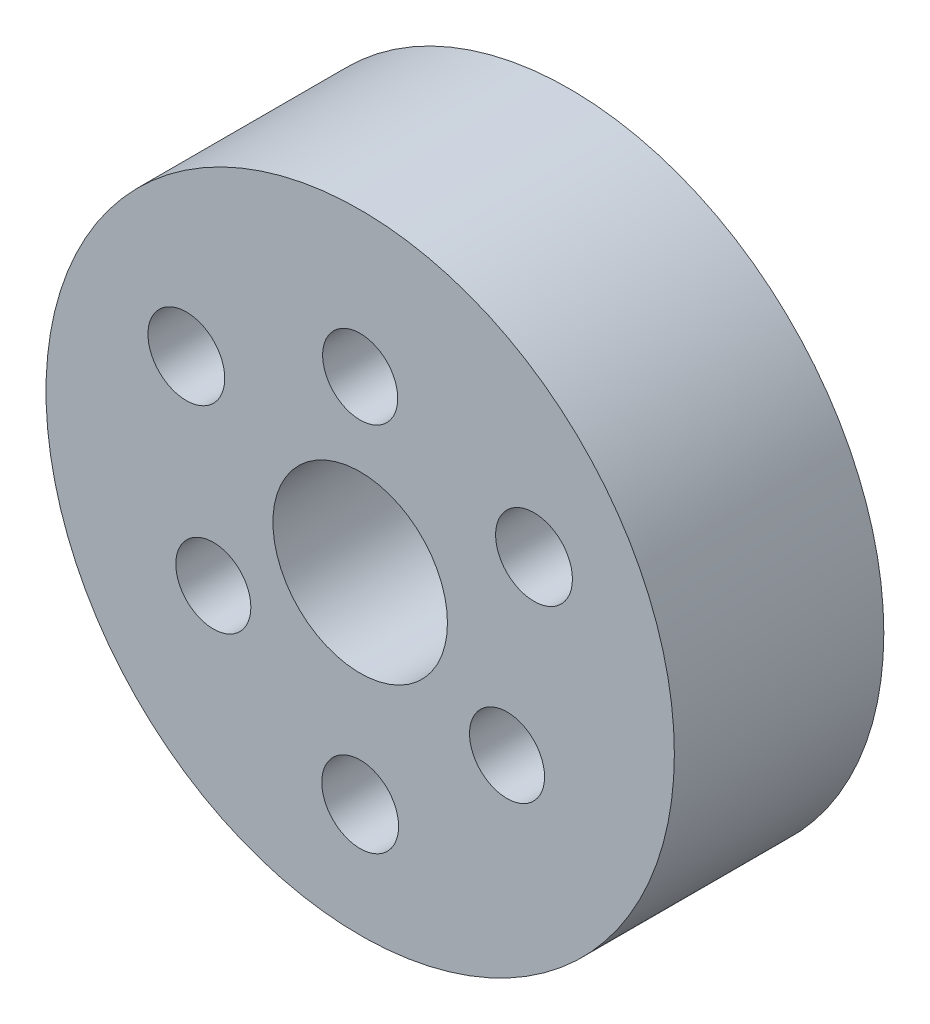
ISO-10303-21;
HEADER;
FILE_DESCRIPTION(('STEP AP214'),'2;1');
FILE_NAME('part.step','',(''),(''),'','','');
FILE_SCHEMA(('AUTOMOTIVE_DESIGN { 1 0 10303 214 1 1 1 1 }'));
ENDSEC;
DATA;
#1=APPLICATION_CONTEXT('core data for automotive mechanical design processes');
#2=APPLICATION_PROTOCOL_DEFINITION('international standard','automotive_design',2000,#1);
#3=PRODUCT_CONTEXT('',#1,'mechanical');
#4=PRODUCT('Part','Part','',(#3));
#5=PRODUCT_RELATED_PRODUCT_CATEGORY('part','',(#4));
#6=PRODUCT_DEFINITION_FORMATION('','',#4);
#7=PRODUCT_DEFINITION_CONTEXT('part definition',#1,'design');
#8=PRODUCT_DEFINITION('design','',#6,#7);
#9=PRODUCT_DEFINITION_SHAPE('','',#8);
#10=(LENGTH_UNIT() NAMED_UNIT(*) SI_UNIT(.MILLI.,.METRE.));
#11=(NAMED_UNIT(*) PLANE_ANGLE_UNIT() SI_UNIT($,.RADIAN.));
#12=(NAMED_UNIT(*) SI_UNIT($,.STERADIAN.) SOLID_ANGLE_UNIT());
#13=UNCERTAINTY_MEASURE_WITH_UNIT(LENGTH_MEASURE(1.E-05),#10,'distance_accuracy_value','');
#14=(GEOMETRIC_REPRESENTATION_CONTEXT(3) GLOBAL_UNCERTAINTY_ASSIGNED_CONTEXT((#13)) GLOBAL_UNIT_ASSIGNED_CONTEXT((#10,
#11,#12)) REPRESENTATION_CONTEXT('',''));
#15=CARTESIAN_POINT('',(0.,0.,0.));
#16=DIRECTION('',(0.,0.,1.));
#17=DIRECTION('',(1.,0.,0.));
#18=AXIS2_PLACEMENT_3D('',#15,#16,#17);
#19=CARTESIAN_POINT('',(0.,0.,12.));
#20=DIRECTION('',(0.,0.,-1.));
#21=DIRECTION('',(-1.,0.,0.));
#22=AXIS2_PLACEMENT_3D('',#19,#20,#21);
#23=CYLINDRICAL_SURFACE('',#22,18.);
#24=CARTESIAN_POINT('',(0.,0.,12.));
#25=DIRECTION('',(0.,0.,1.));
#26=DIRECTION('',(1.,0.,0.));
#27=AXIS2_PLACEMENT_3D('',#24,#25,#26);
#28=CIRCLE('',#27,18.);
#29=CARTESIAN_POINT('',(18.,0.,12.));
#30=VERTEX_POINT('',#29);
#31=EDGE_CURVE('E10',#30,#30,#28,.T.);
#32=ORIENTED_EDGE('',*,*,#31,.F.);
#33=EDGE_LOOP('',(#32));
#34=FACE_BOUND('',#33,.T.);
#35=CARTESIAN_POINT('',(0.,0.,0.));
#36=DIRECTION('',(0.,0.,1.));
#37=DIRECTION('',(1.,0.,0.));
#38=AXIS2_PLACEMENT_3D('',#35,#36,#37);
#39=CIRCLE('',#38,18.);
#40=CARTESIAN_POINT('',(18.,0.,0.));
#41=VERTEX_POINT('',#40);
#42=EDGE_CURVE('E40',#41,#41,#39,.T.);
#43=ORIENTED_EDGE('',*,*,#42,.T.);
#44=EDGE_LOOP('',(#43));
#45=FACE_BOUND('',#44,.T.);
#46=ADVANCED_FACE('F37',(#34,#45),#23,.T.);
#47=CARTESIAN_POINT('',(0.,0.,12.));
#48=DIRECTION('',(0.,0.,1.));
#49=DIRECTION('',(1.,0.,0.));
#50=AXIS2_PLACEMENT_3D('',#47,#48,#49);
#51=PLANE('',#50);
#52=CARTESIAN_POINT('',(0.,0.,12.));
#53=DIRECTION('',(0.,0.,1.));
#54=DIRECTION('',(1.,0.,0.));
#55=AXIS2_PLACEMENT_3D('',#52,#53,#54);
#56=CIRCLE('',#55,5.);
#57=CARTESIAN_POINT('',(5.,0.,12.));
#58=VERTEX_POINT('',#57);
#59=EDGE_CURVE('E85',#58,#58,#56,.T.);
#60=ORIENTED_EDGE('',*,*,#59,.F.);
#61=EDGE_LOOP('',(#60));
#62=FACE_BOUND('',#61,.T.);
#63=CARTESIAN_POINT('',(-9.95929214352113,5.75000000000004,12.));
#64=DIRECTION('',(0.,0.,1.));
#65=DIRECTION('',(1.,0.,0.));
#66=AXIS2_PLACEMENT_3D('',#63,#64,#65);
#67=CIRCLE('',#66,2.20000000000001);
#68=CARTESIAN_POINT('',(-7.75929214352112,5.75000000000004,12.));
#69=VERTEX_POINT('',#68);
#70=EDGE_CURVE('E70',#69,#69,#67,.T.);
#71=ORIENTED_EDGE('',*,*,#70,.F.);
#72=EDGE_LOOP('',(#71));
#73=FACE_BOUND('',#72,.T.);
#74=CARTESIAN_POINT('',(0.,-11.4999999999999,12.));
#75=DIRECTION('',(0.,0.,1.));
#76=DIRECTION('',(1.,0.,0.));
#77=AXIS2_PLACEMENT_3D('',#74,#75,#76);
#78=CIRCLE('',#77,2.20000000000002);
#79=CARTESIAN_POINT('',(2.20000000000002,-11.4999999999999,12.));
#80=VERTEX_POINT('',#79);
#81=EDGE_CURVE('E59',#80,#80,#78,.T.);
#82=ORIENTED_EDGE('',*,*,#81,.F.);
#83=EDGE_LOOP('',(#82));
#84=FACE_BOUND('',#83,.T.);
#85=CARTESIAN_POINT('',(-8.41343679776582,-4.8575,12.));
#86=DIRECTION('',(0.,0.,1.));
#87=DIRECTION('',(1.,0.,0.));
#88=AXIS2_PLACEMENT_3D('',#85,#86,#87);
#89=CIRCLE('',#88,2.15);
#90=CARTESIAN_POINT('',(-6.26343679776582,-4.8575,12.));
#91=VERTEX_POINT('',#90);
#92=EDGE_CURVE('E58',#91,#91,#89,.T.);
#93=ORIENTED_EDGE('',*,*,#92,.F.);
#94=EDGE_LOOP('',(#93));
#95=FACE_BOUND('',#94,.T.);
#96=CARTESIAN_POINT('',(8.41343679776582,-4.8575,12.));
#97=DIRECTION('',(0.,0.,1.));
#98=DIRECTION('',(1.,0.,0.));
#99=AXIS2_PLACEMENT_3D('',#96,#97,#98);
#100=CIRCLE('',#99,2.15);
#101=CARTESIAN_POINT('',(10.5634367977658,-4.8575,12.));
#102=VERTEX_POINT('',#101);
#103=EDGE_CURVE('E52',#102,#102,#100,.T.);
#104=ORIENTED_EDGE('',*,*,#103,.F.);
#105=EDGE_LOOP('',(#104));
#106=FACE_BOUND('',#105,.T.);
#107=CARTESIAN_POINT('',(9.95929214352096,5.75000000000015,12.));
#108=DIRECTION('',(0.,0.,1.));
#109=DIRECTION('',(1.,0.,0.));
#110=AXIS2_PLACEMENT_3D('',#107,#108,#109);
#111=CIRCLE('',#110,2.20000000000002);
#112=CARTESIAN_POINT('',(12.159292143521,5.75000000000015,12.));
#113=VERTEX_POINT('',#112);
#114=EDGE_CURVE('E71',#113,#113,#111,.T.);
#115=ORIENTED_EDGE('',*,*,#114,.F.);
#116=EDGE_LOOP('',(#115));
#117=FACE_BOUND('',#116,.T.);
#118=CARTESIAN_POINT('',(0.,9.715,12.));
#119=DIRECTION('',(0.,0.,1.));
#120=DIRECTION('',(1.,0.,0.));
#121=AXIS2_PLACEMENT_3D('',#118,#119,#120);
#122=CIRCLE('',#121,2.15);
#123=CARTESIAN_POINT('',(2.15,9.715,12.));
#124=VERTEX_POINT('',#123);
#125=EDGE_CURVE('E49',#124,#124,#122,.T.);
#126=ORIENTED_EDGE('',*,*,#125,.F.);
#127=EDGE_LOOP('',(#126));
#128=FACE_BOUND('',#127,.T.);
#129=ORIENTED_EDGE('',*,*,#31,.T.);
#130=EDGE_LOOP('',(#129));
#131=FACE_BOUND('',#130,.T.);
#132=ADVANCED_FACE('F101',(#62,#73,#84,#95,#106,#117,#128,#131),#51,.T.);
#133=CARTESIAN_POINT('',(0.,0.,0.));
#134=DIRECTION('',(0.,0.,1.));
#135=DIRECTION('',(1.,0.,0.));
#136=AXIS2_PLACEMENT_3D('',#133,#134,#135);
#137=PLANE('',#136);
#138=CARTESIAN_POINT('',(0.,0.,0.));
#139=DIRECTION('',(0.,0.,1.));
#140=DIRECTION('',(1.,0.,0.));
#141=AXIS2_PLACEMENT_3D('',#138,#139,#140);
#142=CIRCLE('',#141,5.);
#143=CARTESIAN_POINT('',(5.,0.,0.));
#144=VERTEX_POINT('',#143);
#145=EDGE_CURVE('E82',#144,#144,#142,.T.);
#146=ORIENTED_EDGE('',*,*,#145,.T.);
#147=EDGE_LOOP('',(#146));
#148=FACE_BOUND('',#147,.T.);
#149=CARTESIAN_POINT('',(-9.95929214352113,5.75000000000004,0.));
#150=DIRECTION('',(0.,0.,1.));
#151=DIRECTION('',(1.,0.,0.));
#152=AXIS2_PLACEMENT_3D('',#149,#150,#151);
#153=CIRCLE('',#152,2.20000000000001);
#154=CARTESIAN_POINT('',(-7.75929214352112,5.75000000000004,0.));
#155=VERTEX_POINT('',#154);
#156=EDGE_CURVE('E67',#155,#155,#153,.T.);
#157=ORIENTED_EDGE('',*,*,#156,.T.);
#158=EDGE_LOOP('',(#157));
#159=FACE_BOUND('',#158,.T.);
#160=CARTESIAN_POINT('',(0.,-11.4999999999999,0.));
#161=DIRECTION('',(0.,0.,1.));
#162=DIRECTION('',(1.,0.,0.));
#163=AXIS2_PLACEMENT_3D('',#160,#161,#162);
#164=CIRCLE('',#163,2.20000000000002);
#165=CARTESIAN_POINT('',(2.20000000000002,-11.4999999999999,0.));
#166=VERTEX_POINT('',#165);
#167=EDGE_CURVE('E74',#166,#166,#164,.T.);
#168=ORIENTED_EDGE('',*,*,#167,.T.);
#169=EDGE_LOOP('',(#168));
#170=FACE_BOUND('',#169,.T.);
#171=CARTESIAN_POINT('',(-8.41343679776582,-4.8575,0.));
#172=DIRECTION('',(0.,0.,1.));
#173=DIRECTION('',(1.,0.,0.));
#174=AXIS2_PLACEMENT_3D('',#171,#172,#173);
#175=CIRCLE('',#174,2.15);
#176=CARTESIAN_POINT('',(-6.26343679776582,-4.8575,0.));
#177=VERTEX_POINT('',#176);
#178=EDGE_CURVE('E55',#177,#177,#175,.T.);
#179=ORIENTED_EDGE('',*,*,#178,.T.);
#180=EDGE_LOOP('',(#179));
#181=FACE_BOUND('',#180,.T.);
#182=CARTESIAN_POINT('',(8.41343679776582,-4.8575,0.));
#183=DIRECTION('',(0.,0.,1.));
#184=DIRECTION('',(1.,0.,0.));
#185=AXIS2_PLACEMENT_3D('',#182,#183,#184);
#186=CIRCLE('',#185,2.15);
#187=CARTESIAN_POINT('',(10.5634367977658,-4.8575,0.));
#188=VERTEX_POINT('',#187);
#189=EDGE_CURVE('E62',#188,#188,#186,.T.);
#190=ORIENTED_EDGE('',*,*,#189,.T.);
#191=EDGE_LOOP('',(#190));
#192=FACE_BOUND('',#191,.T.);
#193=CARTESIAN_POINT('',(9.95929214352096,5.75000000000015,0.));
#194=DIRECTION('',(0.,0.,1.));
#195=DIRECTION('',(1.,0.,0.));
#196=AXIS2_PLACEMENT_3D('',#193,#194,#195);
#197=CIRCLE('',#196,2.20000000000002);
#198=CARTESIAN_POINT('',(12.159292143521,5.75000000000015,0.));
#199=VERTEX_POINT('',#198);
#200=EDGE_CURVE('E79',#199,#199,#197,.T.);
#201=ORIENTED_EDGE('',*,*,#200,.T.);
#202=EDGE_LOOP('',(#201));
#203=FACE_BOUND('',#202,.T.);
#204=CARTESIAN_POINT('',(0.,9.715,0.));
#205=DIRECTION('',(0.,0.,1.));
#206=DIRECTION('',(1.,0.,0.));
#207=AXIS2_PLACEMENT_3D('',#204,#205,#206);
#208=CIRCLE('',#207,2.15);
#209=CARTESIAN_POINT('',(2.15,9.715,0.));
#210=VERTEX_POINT('',#209);
#211=EDGE_CURVE('E47',#210,#210,#208,.T.);
#212=ORIENTED_EDGE('',*,*,#211,.T.);
#213=EDGE_LOOP('',(#212));
#214=FACE_BOUND('',#213,.T.);
#215=ORIENTED_EDGE('',*,*,#42,.F.);
#216=EDGE_LOOP('',(#215));
#217=FACE_BOUND('',#216,.T.);
#218=ADVANCED_FACE('F91',(#148,#159,#170,#181,#192,#203,#214,#217),#137,.F.);
#219=CARTESIAN_POINT('',(0.,9.715,0.));
#220=DIRECTION('',(0.,0.,1.));
#221=DIRECTION('',(1.,0.,0.));
#222=AXIS2_PLACEMENT_3D('',#219,#220,#221);
#223=CYLINDRICAL_SURFACE('',#222,2.15);
#224=ORIENTED_EDGE('',*,*,#211,.F.);
#225=EDGE_LOOP('',(#224));
#226=FACE_BOUND('',#225,.T.);
#227=ORIENTED_EDGE('',*,*,#125,.T.);
#228=EDGE_LOOP('',(#227));
#229=FACE_BOUND('',#228,.T.);
#230=ADVANCED_FACE('F117',(#226,#229),#223,.F.);
#231=CARTESIAN_POINT('',(9.95929214352096,5.75000000000015,0.));
#232=DIRECTION('',(0.,0.,1.));
#233=DIRECTION('',(1.,0.,0.));
#234=AXIS2_PLACEMENT_3D('',#231,#232,#233);
#235=CYLINDRICAL_SURFACE('',#234,2.20000000000002);
#236=ORIENTED_EDGE('',*,*,#200,.F.);
#237=EDGE_LOOP('',(#236));
#238=FACE_BOUND('',#237,.T.);
#239=ORIENTED_EDGE('',*,*,#114,.T.);
#240=EDGE_LOOP('',(#239));
#241=FACE_BOUND('',#240,.T.);
#242=ADVANCED_FACE('F119',(#238,#241),#235,.F.);
#243=CARTESIAN_POINT('',(8.41343679776582,-4.8575,0.));
#244=DIRECTION('',(0.,0.,1.));
#245=DIRECTION('',(1.,0.,0.));
#246=AXIS2_PLACEMENT_3D('',#243,#244,#245);
#247=CYLINDRICAL_SURFACE('',#246,2.15);
#248=ORIENTED_EDGE('',*,*,#189,.F.);
#249=EDGE_LOOP('',(#248));
#250=FACE_BOUND('',#249,.T.);
#251=ORIENTED_EDGE('',*,*,#103,.T.);
#252=EDGE_LOOP('',(#251));
#253=FACE_BOUND('',#252,.T.);
#254=ADVANCED_FACE('F126',(#250,#253),#247,.F.);
#255=CARTESIAN_POINT('',(-8.41343679776582,-4.8575,0.));
#256=DIRECTION('',(0.,0.,1.));
#257=DIRECTION('',(1.,0.,0.));
#258=AXIS2_PLACEMENT_3D('',#255,#256,#257);
#259=CYLINDRICAL_SURFACE('',#258,2.15);
#260=ORIENTED_EDGE('',*,*,#178,.F.);
#261=EDGE_LOOP('',(#260));
#262=FACE_BOUND('',#261,.T.);
#263=ORIENTED_EDGE('',*,*,#92,.T.);
#264=EDGE_LOOP('',(#263));
#265=FACE_BOUND('',#264,.T.);
#266=ADVANCED_FACE('F174',(#262,#265),#259,.F.);
#267=CARTESIAN_POINT('',(0.,-11.4999999999999,0.));
#268=DIRECTION('',(0.,0.,1.));
#269=DIRECTION('',(1.,0.,0.));
#270=AXIS2_PLACEMENT_3D('',#267,#268,#269);
#271=CYLINDRICAL_SURFACE('',#270,2.20000000000002);
#272=ORIENTED_EDGE('',*,*,#167,.F.);
#273=EDGE_LOOP('',(#272));
#274=FACE_BOUND('',#273,.T.);
#275=ORIENTED_EDGE('',*,*,#81,.T.);
#276=EDGE_LOOP('',(#275));
#277=FACE_BOUND('',#276,.T.);
#278=ADVANCED_FACE('F167',(#274,#277),#271,.F.);
#279=CARTESIAN_POINT('',(-9.95929214352113,5.75000000000004,0.));
#280=DIRECTION('',(0.,0.,1.));
#281=DIRECTION('',(1.,0.,0.));
#282=AXIS2_PLACEMENT_3D('',#279,#280,#281);
#283=CYLINDRICAL_SURFACE('',#282,2.20000000000001);
#284=ORIENTED_EDGE('',*,*,#156,.F.);
#285=EDGE_LOOP('',(#284));
#286=FACE_BOUND('',#285,.T.);
#287=ORIENTED_EDGE('',*,*,#70,.T.);
#288=EDGE_LOOP('',(#287));
#289=FACE_BOUND('',#288,.T.);
#290=ADVANCED_FACE('F97',(#286,#289),#283,.F.);
#291=CARTESIAN_POINT('',(0.,0.,0.));
#292=DIRECTION('',(0.,0.,1.));
#293=DIRECTION('',(1.,0.,0.));
#294=AXIS2_PLACEMENT_3D('',#291,#292,#293);
#295=CYLINDRICAL_SURFACE('',#294,5.);
#296=ORIENTED_EDGE('',*,*,#145,.F.);
#297=EDGE_LOOP('',(#296));
#298=FACE_BOUND('',#297,.T.);
#299=ORIENTED_EDGE('',*,*,#59,.T.);
#300=EDGE_LOOP('',(#299));
#301=FACE_BOUND('',#300,.T.);
#302=ADVANCED_FACE('F94',(#298,#301),#295,.F.);
#303=CLOSED_SHELL('',(#46,#132,#218,#230,#242,#254,#266,#278,#290,#302));
#304=MANIFOLD_SOLID_BREP('B2',#303);
#305=ADVANCED_BREP_SHAPE_REPRESENTATION('',(#18,#304),#14);
#306=SHAPE_DEFINITION_REPRESENTATION(#9,#305);
ENDSEC;
END-ISO-10303-21;
